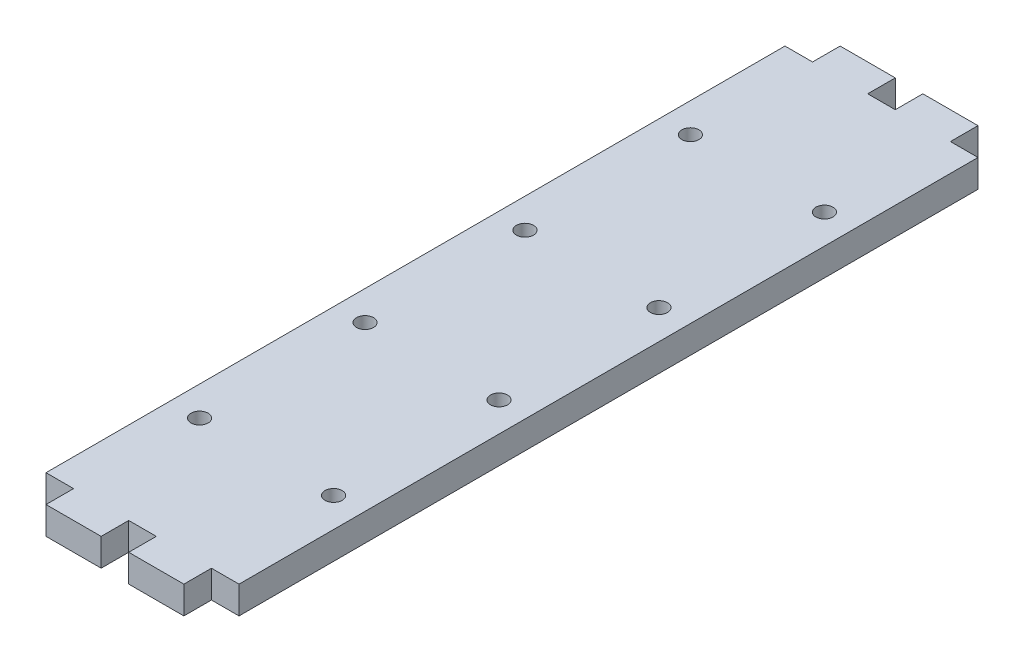
ISO-10303-21;
HEADER;
FILE_DESCRIPTION(('STEP AP214'),'2;1');
FILE_NAME('part.step','',(''),(''),'','','');
FILE_SCHEMA(('AUTOMOTIVE_DESIGN { 1 0 10303 214 1 1 1 1 }'));
ENDSEC;
DATA;
#1=APPLICATION_CONTEXT('core data for automotive mechanical design processes');
#2=APPLICATION_PROTOCOL_DEFINITION('international standard','automotive_design',2000,#1);
#3=PRODUCT_CONTEXT('',#1,'mechanical');
#4=PRODUCT('Part','Part','',(#3));
#5=PRODUCT_RELATED_PRODUCT_CATEGORY('part','',(#4));
#6=PRODUCT_DEFINITION_FORMATION('','',#4);
#7=PRODUCT_DEFINITION_CONTEXT('part definition',#1,'design');
#8=PRODUCT_DEFINITION('design','',#6,#7);
#9=PRODUCT_DEFINITION_SHAPE('','',#8);
#10=(LENGTH_UNIT() NAMED_UNIT(*) SI_UNIT(.MILLI.,.METRE.));
#11=(NAMED_UNIT(*) PLANE_ANGLE_UNIT() SI_UNIT($,.RADIAN.));
#12=(NAMED_UNIT(*) SI_UNIT($,.STERADIAN.) SOLID_ANGLE_UNIT());
#13=UNCERTAINTY_MEASURE_WITH_UNIT(LENGTH_MEASURE(1.E-05),#10,'distance_accuracy_value','');
#14=(GEOMETRIC_REPRESENTATION_CONTEXT(3) GLOBAL_UNCERTAINTY_ASSIGNED_CONTEXT((#13)) GLOBAL_UNIT_ASSIGNED_CONTEXT((#10,
#11,#12)) REPRESENTATION_CONTEXT('',''));
#15=CARTESIAN_POINT('',(0.,0.,0.));
#16=DIRECTION('',(0.,0.,1.));
#17=DIRECTION('',(1.,0.,0.));
#18=AXIS2_PLACEMENT_3D('',#15,#16,#17);
#19=CARTESIAN_POINT('',(0.,5.,0.));
#20=DIRECTION('',(0.,-1.,0.));
#21=DIRECTION('',(0.,0.,-1.));
#22=AXIS2_PLACEMENT_3D('',#19,#20,#21);
#23=PLANE('',#22);
#24=DIRECTION('',(0.,0.,1.));
#25=VECTOR('',#24,1.);
#26=CARTESIAN_POINT('',(-10.,5.,-65.2114285714286));
#27=LINE('',#26,#25);
#28=CARTESIAN_POINT('',(-10.,5.,-65.2114285714286));
#29=VERTEX_POINT('',#28);
#30=CARTESIAN_POINT('',(-10.,5.,-60.2114285714286));
#31=VERTEX_POINT('',#30);
#32=EDGE_CURVE('E242',#29,#31,#27,.T.);
#33=ORIENTED_EDGE('',*,*,#32,.T.);
#34=DIRECTION('',(-1.,0.,0.));
#35=VECTOR('',#34,1.);
#36=CARTESIAN_POINT('',(-10.,5.,-60.2114285714286));
#37=LINE('',#36,#35);
#38=CARTESIAN_POINT('',(-15.,5.,-60.2114285714286));
#39=VERTEX_POINT('',#38);
#40=EDGE_CURVE('E130',#31,#39,#37,.T.);
#41=ORIENTED_EDGE('',*,*,#40,.T.);
#42=DIRECTION('',(0.,0.,1.));
#43=VECTOR('',#42,1.);
#44=CARTESIAN_POINT('',(-15.,5.,-60.2114285714286));
#45=LINE('',#44,#43);
#46=CARTESIAN_POINT('',(-15.,5.,73.7885714285714));
#47=VERTEX_POINT('',#46);
#48=EDGE_CURVE('E293',#39,#47,#45,.T.);
#49=ORIENTED_EDGE('',*,*,#48,.T.);
#50=DIRECTION('',(1.,0.,0.));
#51=VECTOR('',#50,1.);
#52=CARTESIAN_POINT('',(-9.99999999999998,5.,73.7885714285714));
#53=LINE('',#52,#51);
#54=CARTESIAN_POINT('',(-9.99999999999998,5.,73.7885714285714));
#55=VERTEX_POINT('',#54);
#56=EDGE_CURVE('E312',#47,#55,#53,.T.);
#57=ORIENTED_EDGE('',*,*,#56,.T.);
#58=DIRECTION('',(0.,0.,1.));
#59=VECTOR('',#58,1.);
#60=CARTESIAN_POINT('',(-9.99999999999998,5.,78.7885714285714));
#61=LINE('',#60,#59);
#62=CARTESIAN_POINT('',(-9.99999999999998,5.,78.7885714285714));
#63=VERTEX_POINT('',#62);
#64=EDGE_CURVE('E309',#55,#63,#61,.T.);
#65=ORIENTED_EDGE('',*,*,#64,.T.);
#66=DIRECTION('',(1.,0.,0.));
#67=VECTOR('',#66,1.);
#68=CARTESIAN_POINT('',(-9.99999999999998,5.,78.7885714285714));
#69=LINE('',#68,#67);
#70=CARTESIAN_POINT('',(0.,5.,78.7885714285714));
#71=VERTEX_POINT('',#70);
#72=EDGE_CURVE('E311',#63,#71,#69,.T.);
#73=ORIENTED_EDGE('',*,*,#72,.T.);
#74=DIRECTION('',(0.,0.,-1.));
#75=VECTOR('',#74,1.);
#76=CARTESIAN_POINT('',(0.,5.,78.7885714285714));
#77=LINE('',#76,#75);
#78=CARTESIAN_POINT('',(0.,5.,73.7885714285714));
#79=VERTEX_POINT('',#78);
#80=EDGE_CURVE('E314',#71,#79,#77,.T.);
#81=ORIENTED_EDGE('',*,*,#80,.T.);
#82=DIRECTION('',(1.,0.,0.));
#83=VECTOR('',#82,1.);
#84=CARTESIAN_POINT('',(0.,5.,73.7885714285714));
#85=LINE('',#84,#83);
#86=CARTESIAN_POINT('',(5.,5.,73.7885714285714));
#87=VERTEX_POINT('',#86);
#88=EDGE_CURVE('E320',#79,#87,#85,.T.);
#89=ORIENTED_EDGE('',*,*,#88,.T.);
#90=DIRECTION('',(0.,0.,1.));
#91=VECTOR('',#90,1.);
#92=CARTESIAN_POINT('',(5.,5.,73.7885714285714));
#93=LINE('',#92,#91);
#94=CARTESIAN_POINT('',(5.,5.,78.7885714285714));
#95=VERTEX_POINT('',#94);
#96=EDGE_CURVE('E322',#87,#95,#93,.T.);
#97=ORIENTED_EDGE('',*,*,#96,.T.);
#98=DIRECTION('',(1.,0.,0.));
#99=VECTOR('',#98,1.);
#100=CARTESIAN_POINT('',(5.,5.,78.7885714285714));
#101=LINE('',#100,#99);
#102=CARTESIAN_POINT('',(15.,5.,78.7885714285714));
#103=VERTEX_POINT('',#102);
#104=EDGE_CURVE('E324',#95,#103,#101,.T.);
#105=ORIENTED_EDGE('',*,*,#104,.T.);
#106=DIRECTION('',(0.,0.,-1.));
#107=VECTOR('',#106,1.);
#108=CARTESIAN_POINT('',(15.,5.,78.7885714285714));
#109=LINE('',#108,#107);
#110=CARTESIAN_POINT('',(15.,5.,73.7885714285714));
#111=VERTEX_POINT('',#110);
#112=EDGE_CURVE('E326',#103,#111,#109,.T.);
#113=ORIENTED_EDGE('',*,*,#112,.T.);
#114=DIRECTION('',(1.,0.,0.));
#115=VECTOR('',#114,1.);
#116=CARTESIAN_POINT('',(15.,5.,73.7885714285714));
#117=LINE('',#116,#115);
#118=CARTESIAN_POINT('',(20.,5.,73.7885714285714));
#119=VERTEX_POINT('',#118);
#120=EDGE_CURVE('E328',#111,#119,#117,.T.);
#121=ORIENTED_EDGE('',*,*,#120,.T.);
#122=DIRECTION('',(0.,0.,-1.));
#123=VECTOR('',#122,1.);
#124=CARTESIAN_POINT('',(20.,5.,-60.2114285714286));
#125=LINE('',#124,#123);
#126=CARTESIAN_POINT('',(20.,5.,-60.2114285714286));
#127=VERTEX_POINT('',#126);
#128=EDGE_CURVE('E330',#119,#127,#125,.T.);
#129=ORIENTED_EDGE('',*,*,#128,.T.);
#130=DIRECTION('',(-1.,0.,0.));
#131=VECTOR('',#130,1.);
#132=CARTESIAN_POINT('',(15.,5.,-60.2114285714286));
#133=LINE('',#132,#131);
#134=CARTESIAN_POINT('',(15.,5.,-60.2114285714286));
#135=VERTEX_POINT('',#134);
#136=EDGE_CURVE('E332',#127,#135,#133,.T.);
#137=ORIENTED_EDGE('',*,*,#136,.T.);
#138=DIRECTION('',(0.,0.,-1.));
#139=VECTOR('',#138,1.);
#140=CARTESIAN_POINT('',(15.,5.,-65.2114285714286));
#141=LINE('',#140,#139);
#142=CARTESIAN_POINT('',(15.,5.,-65.2114285714286));
#143=VERTEX_POINT('',#142);
#144=EDGE_CURVE('E334',#135,#143,#141,.T.);
#145=ORIENTED_EDGE('',*,*,#144,.T.);
#146=DIRECTION('',(-1.,0.,0.));
#147=VECTOR('',#146,1.);
#148=CARTESIAN_POINT('',(15.,5.,-65.2114285714286));
#149=LINE('',#148,#147);
#150=CARTESIAN_POINT('',(5.,5.,-65.2114285714286));
#151=VERTEX_POINT('',#150);
#152=EDGE_CURVE('E336',#143,#151,#149,.T.);
#153=ORIENTED_EDGE('',*,*,#152,.T.);
#154=DIRECTION('',(0.,0.,1.));
#155=VECTOR('',#154,1.);
#156=CARTESIAN_POINT('',(5.,5.,-65.2114285714286));
#157=LINE('',#156,#155);
#158=CARTESIAN_POINT('',(5.,5.,-60.2114285714286));
#159=VERTEX_POINT('',#158);
#160=EDGE_CURVE('E185',#151,#159,#157,.T.);
#161=ORIENTED_EDGE('',*,*,#160,.T.);
#162=DIRECTION('',(-1.,0.,0.));
#163=VECTOR('',#162,1.);
#164=CARTESIAN_POINT('',(5.,5.,-60.2114285714286));
#165=LINE('',#164,#163);
#166=CARTESIAN_POINT('',(0.,5.,-60.2114285714286));
#167=VERTEX_POINT('',#166);
#168=EDGE_CURVE('E179',#159,#167,#165,.T.);
#169=ORIENTED_EDGE('',*,*,#168,.T.);
#170=DIRECTION('',(0.,0.,-1.));
#171=VECTOR('',#170,1.);
#172=CARTESIAN_POINT('',(0.,5.,-60.2114285714286));
#173=LINE('',#172,#171);
#174=CARTESIAN_POINT('',(0.,5.,-65.2114285714286));
#175=VERTEX_POINT('',#174);
#176=EDGE_CURVE('E183',#167,#175,#173,.T.);
#177=ORIENTED_EDGE('',*,*,#176,.T.);
#178=DIRECTION('',(-1.,0.,0.));
#179=VECTOR('',#178,1.);
#180=CARTESIAN_POINT('',(0.,5.,-65.2114285714286));
#181=LINE('',#180,#179);
#182=EDGE_CURVE('E51',#175,#29,#181,.T.);
#183=ORIENTED_EDGE('',*,*,#182,.T.);
#184=EDGE_LOOP('',(#33,#41,#49,#57,#65,#73,#81,#89,#97,#105,#113,#121,#129,#137,#145,#153,#161,
#169,#177,#183));
#185=FACE_BOUND('',#184,.T.);
#186=CARTESIAN_POINT('',(-9.64999999999999,5.,-37.7114285714286));
#187=DIRECTION('',(0.,1.,0.));
#188=DIRECTION('',(0.,0.,1.));
#189=AXIS2_PLACEMENT_3D('',#186,#187,#188);
#190=CIRCLE('',#189,1.55);
#191=CARTESIAN_POINT('',(-9.64999999999999,5.,-36.1614285714286));
#192=VERTEX_POINT('',#191);
#193=EDGE_CURVE('E207',#192,#192,#190,.T.);
#194=ORIENTED_EDGE('',*,*,#193,.F.);
#195=EDGE_LOOP('',(#194));
#196=FACE_BOUND('',#195,.T.);
#197=CARTESIAN_POINT('',(14.65,5.,-7.71142857142858));
#198=DIRECTION('',(0.,1.,0.));
#199=DIRECTION('',(0.,0.,1.));
#200=AXIS2_PLACEMENT_3D('',#197,#198,#199);
#201=CIRCLE('',#200,1.55);
#202=CARTESIAN_POINT('',(14.65,5.,-6.16142857142858));
#203=VERTEX_POINT('',#202);
#204=EDGE_CURVE('E440',#203,#203,#201,.T.);
#205=ORIENTED_EDGE('',*,*,#204,.F.);
#206=EDGE_LOOP('',(#205));
#207=FACE_BOUND('',#206,.T.);
#208=CARTESIAN_POINT('',(-9.64999999999998,5.,-7.71142857142858));
#209=DIRECTION('',(0.,1.,0.));
#210=DIRECTION('',(0.,0.,1.));
#211=AXIS2_PLACEMENT_3D('',#208,#209,#210);
#212=CIRCLE('',#211,1.55);
#213=CARTESIAN_POINT('',(-9.64999999999998,5.,-6.16142857142858));
#214=VERTEX_POINT('',#213);
#215=EDGE_CURVE('E434',#214,#214,#212,.T.);
#216=ORIENTED_EDGE('',*,*,#215,.F.);
#217=EDGE_LOOP('',(#216));
#218=FACE_BOUND('',#217,.T.);
#219=CARTESIAN_POINT('',(14.65,5.,-37.7114285714286));
#220=DIRECTION('',(0.,1.,0.));
#221=DIRECTION('',(0.,0.,1.));
#222=AXIS2_PLACEMENT_3D('',#219,#220,#221);
#223=CIRCLE('',#222,1.55);
#224=CARTESIAN_POINT('',(14.65,5.,-36.1614285714286));
#225=VERTEX_POINT('',#224);
#226=EDGE_CURVE('E428',#225,#225,#223,.T.);
#227=ORIENTED_EDGE('',*,*,#226,.F.);
#228=EDGE_LOOP('',(#227));
#229=FACE_BOUND('',#228,.T.);
#230=CARTESIAN_POINT('',(-9.64999999999997,5.,21.2885714285714));
#231=DIRECTION('',(0.,1.,0.));
#232=DIRECTION('',(0.,0.,-1.));
#233=AXIS2_PLACEMENT_3D('',#230,#231,#232);
#234=CIRCLE('',#233,1.55);
#235=CARTESIAN_POINT('',(-9.64999999999997,5.,19.7385714285714));
#236=VERTEX_POINT('',#235);
#237=EDGE_CURVE('E422',#236,#236,#234,.T.);
#238=ORIENTED_EDGE('',*,*,#237,.F.);
#239=EDGE_LOOP('',(#238));
#240=FACE_BOUND('',#239,.T.);
#241=CARTESIAN_POINT('',(-9.64999999999998,5.,51.2885714285714));
#242=DIRECTION('',(0.,1.,0.));
#243=DIRECTION('',(0.,0.,-1.));
#244=AXIS2_PLACEMENT_3D('',#241,#242,#243);
#245=CIRCLE('',#244,1.55);
#246=CARTESIAN_POINT('',(-9.64999999999998,5.,49.7385714285714));
#247=VERTEX_POINT('',#246);
#248=EDGE_CURVE('E416',#247,#247,#245,.T.);
#249=ORIENTED_EDGE('',*,*,#248,.F.);
#250=EDGE_LOOP('',(#249));
#251=FACE_BOUND('',#250,.T.);
#252=CARTESIAN_POINT('',(14.65,5.,21.2885714285714));
#253=DIRECTION('',(0.,1.,0.));
#254=DIRECTION('',(0.,0.,-1.));
#255=AXIS2_PLACEMENT_3D('',#252,#253,#254);
#256=CIRCLE('',#255,1.55);
#257=CARTESIAN_POINT('',(14.65,5.,19.7385714285714));
#258=VERTEX_POINT('',#257);
#259=EDGE_CURVE('E410',#258,#258,#256,.T.);
#260=ORIENTED_EDGE('',*,*,#259,.F.);
#261=EDGE_LOOP('',(#260));
#262=FACE_BOUND('',#261,.T.);
#263=CARTESIAN_POINT('',(14.65,5.,51.2885714285714));
#264=DIRECTION('',(0.,1.,0.));
#265=DIRECTION('',(0.,0.,-1.));
#266=AXIS2_PLACEMENT_3D('',#263,#264,#265);
#267=CIRCLE('',#266,1.55);
#268=CARTESIAN_POINT('',(14.65,5.,49.7385714285714));
#269=VERTEX_POINT('',#268);
#270=EDGE_CURVE('E401',#269,#269,#267,.T.);
#271=ORIENTED_EDGE('',*,*,#270,.F.);
#272=EDGE_LOOP('',(#271));
#273=FACE_BOUND('',#272,.T.);
#274=ADVANCED_FACE('F34',(#185,#196,#207,#218,#229,#240,#251,#262,#273),#23,.F.);
#275=CARTESIAN_POINT('',(0.,0.,0.));
#276=DIRECTION('',(0.,-1.,0.));
#277=DIRECTION('',(0.,0.,-1.));
#278=AXIS2_PLACEMENT_3D('',#275,#276,#277);
#279=PLANE('',#278);
#280=CARTESIAN_POINT('',(14.65,0.,21.2885714285714));
#281=DIRECTION('',(0.,1.,0.));
#282=DIRECTION('',(0.,0.,-1.));
#283=AXIS2_PLACEMENT_3D('',#280,#281,#282);
#284=CIRCLE('',#283,1.55);
#285=CARTESIAN_POINT('',(14.65,0.,19.7385714285714));
#286=VERTEX_POINT('',#285);
#287=EDGE_CURVE('E407',#286,#286,#284,.T.);
#288=ORIENTED_EDGE('',*,*,#287,.T.);
#289=EDGE_LOOP('',(#288));
#290=FACE_BOUND('',#289,.T.);
#291=CARTESIAN_POINT('',(-9.64999999999997,0.,21.2885714285714));
#292=DIRECTION('',(0.,1.,0.));
#293=DIRECTION('',(0.,0.,-1.));
#294=AXIS2_PLACEMENT_3D('',#291,#292,#293);
#295=CIRCLE('',#294,1.55);
#296=CARTESIAN_POINT('',(-9.64999999999997,0.,19.7385714285714));
#297=VERTEX_POINT('',#296);
#298=EDGE_CURVE('E419',#297,#297,#295,.T.);
#299=ORIENTED_EDGE('',*,*,#298,.T.);
#300=EDGE_LOOP('',(#299));
#301=FACE_BOUND('',#300,.T.);
#302=CARTESIAN_POINT('',(-9.64999999999998,0.,-7.71142857142858));
#303=DIRECTION('',(0.,1.,0.));
#304=DIRECTION('',(0.,0.,1.));
#305=AXIS2_PLACEMENT_3D('',#302,#303,#304);
#306=CIRCLE('',#305,1.55);
#307=CARTESIAN_POINT('',(-9.64999999999998,0.,-6.16142857142858));
#308=VERTEX_POINT('',#307);
#309=EDGE_CURVE('E431',#308,#308,#306,.T.);
#310=ORIENTED_EDGE('',*,*,#309,.T.);
#311=EDGE_LOOP('',(#310));
#312=FACE_BOUND('',#311,.T.);
#313=CARTESIAN_POINT('',(-9.64999999999999,0.,-37.7114285714286));
#314=DIRECTION('',(0.,1.,0.));
#315=DIRECTION('',(0.,0.,1.));
#316=AXIS2_PLACEMENT_3D('',#313,#314,#315);
#317=CIRCLE('',#316,1.55);
#318=CARTESIAN_POINT('',(-9.64999999999999,0.,-36.1614285714286));
#319=VERTEX_POINT('',#318);
#320=EDGE_CURVE('E443',#319,#319,#317,.T.);
#321=ORIENTED_EDGE('',*,*,#320,.T.);
#322=EDGE_LOOP('',(#321));
#323=FACE_BOUND('',#322,.T.);
#324=DIRECTION('',(0.,0.,1.));
#325=VECTOR('',#324,1.);
#326=CARTESIAN_POINT('',(-10.,0.,-65.2114285714286));
#327=LINE('',#326,#325);
#328=CARTESIAN_POINT('',(-10.,0.,-65.2114285714286));
#329=VERTEX_POINT('',#328);
#330=CARTESIAN_POINT('',(-10.,0.,-60.2114285714286));
#331=VERTEX_POINT('',#330);
#332=EDGE_CURVE('E203',#329,#331,#327,.T.);
#333=ORIENTED_EDGE('',*,*,#332,.F.);
#334=DIRECTION('',(-1.,0.,0.));
#335=VECTOR('',#334,1.);
#336=CARTESIAN_POINT('',(0.,0.,-65.2114285714286));
#337=LINE('',#336,#335);
#338=CARTESIAN_POINT('',(0.,0.,-65.2114285714286));
#339=VERTEX_POINT('',#338);
#340=EDGE_CURVE('E122',#339,#329,#337,.T.);
#341=ORIENTED_EDGE('',*,*,#340,.F.);
#342=DIRECTION('',(0.,0.,-1.));
#343=VECTOR('',#342,1.);
#344=CARTESIAN_POINT('',(0.,0.,-60.2114285714286));
#345=LINE('',#344,#343);
#346=CARTESIAN_POINT('',(0.,0.,-60.2114285714286));
#347=VERTEX_POINT('',#346);
#348=EDGE_CURVE('E116',#347,#339,#345,.T.);
#349=ORIENTED_EDGE('',*,*,#348,.F.);
#350=DIRECTION('',(-1.,0.,0.));
#351=VECTOR('',#350,1.);
#352=CARTESIAN_POINT('',(5.,0.,-60.2114285714286));
#353=LINE('',#352,#351);
#354=CARTESIAN_POINT('',(5.,0.,-60.2114285714286));
#355=VERTEX_POINT('',#354);
#356=EDGE_CURVE('E193',#355,#347,#353,.T.);
#357=ORIENTED_EDGE('',*,*,#356,.F.);
#358=DIRECTION('',(0.,0.,1.));
#359=VECTOR('',#358,1.);
#360=CARTESIAN_POINT('',(5.,0.,-65.2114285714286));
#361=LINE('',#360,#359);
#362=CARTESIAN_POINT('',(5.,0.,-65.2114285714286));
#363=VERTEX_POINT('',#362);
#364=EDGE_CURVE('E237',#363,#355,#361,.T.);
#365=ORIENTED_EDGE('',*,*,#364,.F.);
#366=DIRECTION('',(-1.,0.,0.));
#367=VECTOR('',#366,1.);
#368=CARTESIAN_POINT('',(15.,0.,-65.2114285714286));
#369=LINE('',#368,#367);
#370=CARTESIAN_POINT('',(15.,0.,-65.2114285714286));
#371=VERTEX_POINT('',#370);
#372=EDGE_CURVE('E235',#371,#363,#369,.T.);
#373=ORIENTED_EDGE('',*,*,#372,.F.);
#374=DIRECTION('',(0.,0.,-1.));
#375=VECTOR('',#374,1.);
#376=CARTESIAN_POINT('',(15.,0.,-65.2114285714286));
#377=LINE('',#376,#375);
#378=CARTESIAN_POINT('',(15.,0.,-60.2114285714286));
#379=VERTEX_POINT('',#378);
#380=EDGE_CURVE('E233',#379,#371,#377,.T.);
#381=ORIENTED_EDGE('',*,*,#380,.F.);
#382=DIRECTION('',(-1.,0.,0.));
#383=VECTOR('',#382,1.);
#384=CARTESIAN_POINT('',(15.,0.,-60.2114285714286));
#385=LINE('',#384,#383);
#386=CARTESIAN_POINT('',(20.,0.,-60.2114285714286));
#387=VERTEX_POINT('',#386);
#388=EDGE_CURVE('E231',#387,#379,#385,.T.);
#389=ORIENTED_EDGE('',*,*,#388,.F.);
#390=DIRECTION('',(0.,0.,-1.));
#391=VECTOR('',#390,1.);
#392=CARTESIAN_POINT('',(20.,0.,-60.2114285714286));
#393=LINE('',#392,#391);
#394=CARTESIAN_POINT('',(20.,0.,73.7885714285714));
#395=VERTEX_POINT('',#394);
#396=EDGE_CURVE('E229',#395,#387,#393,.T.);
#397=ORIENTED_EDGE('',*,*,#396,.F.);
#398=DIRECTION('',(1.,0.,0.));
#399=VECTOR('',#398,1.);
#400=CARTESIAN_POINT('',(15.,0.,73.7885714285714));
#401=LINE('',#400,#399);
#402=CARTESIAN_POINT('',(15.,0.,73.7885714285714));
#403=VERTEX_POINT('',#402);
#404=EDGE_CURVE('E227',#403,#395,#401,.T.);
#405=ORIENTED_EDGE('',*,*,#404,.F.);
#406=DIRECTION('',(0.,0.,-1.));
#407=VECTOR('',#406,1.);
#408=CARTESIAN_POINT('',(15.,0.,78.7885714285714));
#409=LINE('',#408,#407);
#410=CARTESIAN_POINT('',(15.,0.,78.7885714285714));
#411=VERTEX_POINT('',#410);
#412=EDGE_CURVE('E225',#411,#403,#409,.T.);
#413=ORIENTED_EDGE('',*,*,#412,.F.);
#414=DIRECTION('',(1.,0.,0.));
#415=VECTOR('',#414,1.);
#416=CARTESIAN_POINT('',(5.,0.,78.7885714285714));
#417=LINE('',#416,#415);
#418=CARTESIAN_POINT('',(5.,0.,78.7885714285714));
#419=VERTEX_POINT('',#418);
#420=EDGE_CURVE('E223',#419,#411,#417,.T.);
#421=ORIENTED_EDGE('',*,*,#420,.F.);
#422=DIRECTION('',(0.,0.,1.));
#423=VECTOR('',#422,1.);
#424=CARTESIAN_POINT('',(5.,0.,73.7885714285714));
#425=LINE('',#424,#423);
#426=CARTESIAN_POINT('',(5.,0.,73.7885714285714));
#427=VERTEX_POINT('',#426);
#428=EDGE_CURVE('E221',#427,#419,#425,.T.);
#429=ORIENTED_EDGE('',*,*,#428,.F.);
#430=DIRECTION('',(1.,0.,0.));
#431=VECTOR('',#430,1.);
#432=CARTESIAN_POINT('',(0.,0.,73.7885714285714));
#433=LINE('',#432,#431);
#434=CARTESIAN_POINT('',(0.,0.,73.7885714285714));
#435=VERTEX_POINT('',#434);
#436=EDGE_CURVE('E219',#435,#427,#433,.T.);
#437=ORIENTED_EDGE('',*,*,#436,.F.);
#438=DIRECTION('',(0.,0.,-1.));
#439=VECTOR('',#438,1.);
#440=CARTESIAN_POINT('',(0.,0.,78.7885714285714));
#441=LINE('',#440,#439);
#442=CARTESIAN_POINT('',(0.,0.,78.7885714285714));
#443=VERTEX_POINT('',#442);
#444=EDGE_CURVE('E217',#443,#435,#441,.T.);
#445=ORIENTED_EDGE('',*,*,#444,.F.);
#446=DIRECTION('',(1.,0.,0.));
#447=VECTOR('',#446,1.);
#448=CARTESIAN_POINT('',(-9.99999999999998,0.,78.7885714285714));
#449=LINE('',#448,#447);
#450=CARTESIAN_POINT('',(-9.99999999999998,0.,78.7885714285714));
#451=VERTEX_POINT('',#450);
#452=EDGE_CURVE('E215',#451,#443,#449,.T.);
#453=ORIENTED_EDGE('',*,*,#452,.F.);
#454=DIRECTION('',(0.,0.,1.));
#455=VECTOR('',#454,1.);
#456=CARTESIAN_POINT('',(-9.99999999999998,0.,78.7885714285714));
#457=LINE('',#456,#455);
#458=CARTESIAN_POINT('',(-9.99999999999998,0.,73.7885714285714));
#459=VERTEX_POINT('',#458);
#460=EDGE_CURVE('E213',#459,#451,#457,.T.);
#461=ORIENTED_EDGE('',*,*,#460,.F.);
#462=DIRECTION('',(1.,0.,0.));
#463=VECTOR('',#462,1.);
#464=CARTESIAN_POINT('',(-9.99999999999998,0.,73.7885714285714));
#465=LINE('',#464,#463);
#466=CARTESIAN_POINT('',(-15.,0.,73.7885714285714));
#467=VERTEX_POINT('',#466);
#468=EDGE_CURVE('E211',#467,#459,#465,.T.);
#469=ORIENTED_EDGE('',*,*,#468,.F.);
#470=DIRECTION('',(0.,0.,1.));
#471=VECTOR('',#470,1.);
#472=CARTESIAN_POINT('',(-15.,0.,-60.2114285714286));
#473=LINE('',#472,#471);
#474=CARTESIAN_POINT('',(-15.,0.,-60.2114285714286));
#475=VERTEX_POINT('',#474);
#476=EDGE_CURVE('E209',#475,#467,#473,.T.);
#477=ORIENTED_EDGE('',*,*,#476,.F.);
#478=DIRECTION('',(-1.,0.,0.));
#479=VECTOR('',#478,1.);
#480=CARTESIAN_POINT('',(-10.,0.,-60.2114285714286));
#481=LINE('',#480,#479);
#482=EDGE_CURVE('E206',#331,#475,#481,.T.);
#483=ORIENTED_EDGE('',*,*,#482,.F.);
#484=EDGE_LOOP('',(#333,#341,#349,#357,#365,#373,#381,#389,#397,#405,#413,#421,#429,#437,#445,
#453,#461,#469,#477,#483));
#485=FACE_BOUND('',#484,.T.);
#486=CARTESIAN_POINT('',(14.65,0.,-7.71142857142858));
#487=DIRECTION('',(0.,1.,0.));
#488=DIRECTION('',(0.,0.,1.));
#489=AXIS2_PLACEMENT_3D('',#486,#487,#488);
#490=CIRCLE('',#489,1.55);
#491=CARTESIAN_POINT('',(14.65,0.,-6.16142857142858));
#492=VERTEX_POINT('',#491);
#493=EDGE_CURVE('E437',#492,#492,#490,.T.);
#494=ORIENTED_EDGE('',*,*,#493,.T.);
#495=EDGE_LOOP('',(#494));
#496=FACE_BOUND('',#495,.T.);
#497=CARTESIAN_POINT('',(14.65,0.,-37.7114285714286));
#498=DIRECTION('',(0.,1.,0.));
#499=DIRECTION('',(0.,0.,1.));
#500=AXIS2_PLACEMENT_3D('',#497,#498,#499);
#501=CIRCLE('',#500,1.55);
#502=CARTESIAN_POINT('',(14.65,0.,-36.1614285714286));
#503=VERTEX_POINT('',#502);
#504=EDGE_CURVE('E425',#503,#503,#501,.T.);
#505=ORIENTED_EDGE('',*,*,#504,.T.);
#506=EDGE_LOOP('',(#505));
#507=FACE_BOUND('',#506,.T.);
#508=CARTESIAN_POINT('',(-9.64999999999998,0.,51.2885714285714));
#509=DIRECTION('',(0.,1.,0.));
#510=DIRECTION('',(0.,0.,-1.));
#511=AXIS2_PLACEMENT_3D('',#508,#509,#510);
#512=CIRCLE('',#511,1.55);
#513=CARTESIAN_POINT('',(-9.64999999999998,0.,49.7385714285714));
#514=VERTEX_POINT('',#513);
#515=EDGE_CURVE('E413',#514,#514,#512,.T.);
#516=ORIENTED_EDGE('',*,*,#515,.T.);
#517=EDGE_LOOP('',(#516));
#518=FACE_BOUND('',#517,.T.);
#519=CARTESIAN_POINT('',(14.65,0.,51.2885714285714));
#520=DIRECTION('',(0.,1.,0.));
#521=DIRECTION('',(0.,0.,-1.));
#522=AXIS2_PLACEMENT_3D('',#519,#520,#521);
#523=CIRCLE('',#522,1.55);
#524=CARTESIAN_POINT('',(14.65,0.,49.7385714285714));
#525=VERTEX_POINT('',#524);
#526=EDGE_CURVE('E404',#525,#525,#523,.T.);
#527=ORIENTED_EDGE('',*,*,#526,.T.);
#528=EDGE_LOOP('',(#527));
#529=FACE_BOUND('',#528,.T.);
#530=ADVANCED_FACE('F297',(#290,#301,#312,#323,#485,#496,#507,#518,#529),#279,.T.);
#531=CARTESIAN_POINT('',(-10.,5.,-65.2114285714286));
#532=DIRECTION('',(1.,0.,0.));
#533=DIRECTION('',(0.,0.,-1.));
#534=AXIS2_PLACEMENT_3D('',#531,#532,#533);
#535=PLANE('',#534);
#536=ORIENTED_EDGE('',*,*,#332,.T.);
#537=DIRECTION('',(0.,-1.,0.));
#538=VECTOR('',#537,1.);
#539=CARTESIAN_POINT('',(-10.,5.,-60.2114285714286));
#540=LINE('',#539,#538);
#541=EDGE_CURVE('E11',#31,#331,#540,.T.);
#542=ORIENTED_EDGE('',*,*,#541,.F.);
#543=ORIENTED_EDGE('',*,*,#32,.F.);
#544=DIRECTION('',(0.,-1.,0.));
#545=VECTOR('',#544,1.);
#546=CARTESIAN_POINT('',(-10.,5.,-65.2114285714286));
#547=LINE('',#546,#545);
#548=EDGE_CURVE('E199',#29,#329,#547,.T.);
#549=ORIENTED_EDGE('',*,*,#548,.T.);
#550=EDGE_LOOP('',(#536,#542,#543,#549));
#551=FACE_BOUND('',#550,.T.);
#552=ADVANCED_FACE('F36',(#551),#535,.F.);
#553=CARTESIAN_POINT('',(-10.,5.,-60.2114285714286));
#554=DIRECTION('',(0.,0.,1.));
#555=DIRECTION('',(1.,0.,0.));
#556=AXIS2_PLACEMENT_3D('',#553,#554,#555);
#557=PLANE('',#556);
#558=ORIENTED_EDGE('',*,*,#482,.T.);
#559=DIRECTION('',(0.,-1.,0.));
#560=VECTOR('',#559,1.);
#561=CARTESIAN_POINT('',(-15.,5.,-60.2114285714286));
#562=LINE('',#561,#560);
#563=EDGE_CURVE('E43',#39,#475,#562,.T.);
#564=ORIENTED_EDGE('',*,*,#563,.F.);
#565=ORIENTED_EDGE('',*,*,#40,.F.);
#566=ORIENTED_EDGE('',*,*,#541,.T.);
#567=EDGE_LOOP('',(#558,#564,#565,#566));
#568=FACE_BOUND('',#567,.T.);
#569=ADVANCED_FACE('F671',(#568),#557,.F.);
#570=CARTESIAN_POINT('',(-15.,5.,-60.2114285714286));
#571=DIRECTION('',(1.,0.,0.));
#572=DIRECTION('',(0.,0.,-1.));
#573=AXIS2_PLACEMENT_3D('',#570,#571,#572);
#574=PLANE('',#573);
#575=ORIENTED_EDGE('',*,*,#476,.T.);
#576=DIRECTION('',(0.,-1.,0.));
#577=VECTOR('',#576,1.);
#578=CARTESIAN_POINT('',(-15.,5.,73.7885714285714));
#579=LINE('',#578,#577);
#580=EDGE_CURVE('E285',#47,#467,#579,.T.);
#581=ORIENTED_EDGE('',*,*,#580,.F.);
#582=ORIENTED_EDGE('',*,*,#48,.F.);
#583=ORIENTED_EDGE('',*,*,#563,.T.);
#584=EDGE_LOOP('',(#575,#581,#582,#583));
#585=FACE_BOUND('',#584,.T.);
#586=ADVANCED_FACE('F291',(#585),#574,.F.);
#587=CARTESIAN_POINT('',(-9.99999999999998,5.,73.7885714285714));
#588=DIRECTION('',(0.,0.,-1.));
#589=DIRECTION('',(-1.,0.,0.));
#590=AXIS2_PLACEMENT_3D('',#587,#588,#589);
#591=PLANE('',#590);
#592=ORIENTED_EDGE('',*,*,#468,.T.);
#593=DIRECTION('',(0.,-1.,0.));
#594=VECTOR('',#593,1.);
#595=CARTESIAN_POINT('',(-9.99999999999998,5.,73.7885714285714));
#596=LINE('',#595,#594);
#597=EDGE_CURVE('E282',#55,#459,#596,.T.);
#598=ORIENTED_EDGE('',*,*,#597,.F.);
#599=ORIENTED_EDGE('',*,*,#56,.F.);
#600=ORIENTED_EDGE('',*,*,#580,.T.);
#601=EDGE_LOOP('',(#592,#598,#599,#600));
#602=FACE_BOUND('',#601,.T.);
#603=ADVANCED_FACE('F303',(#602),#591,.F.);
#604=CARTESIAN_POINT('',(-9.99999999999998,5.,78.7885714285714));
#605=DIRECTION('',(1.,0.,0.));
#606=DIRECTION('',(0.,0.,-1.));
#607=AXIS2_PLACEMENT_3D('',#604,#605,#606);
#608=PLANE('',#607);
#609=ORIENTED_EDGE('',*,*,#460,.T.);
#610=DIRECTION('',(0.,-1.,0.));
#611=VECTOR('',#610,1.);
#612=CARTESIAN_POINT('',(-9.99999999999998,5.,78.7885714285714));
#613=LINE('',#612,#611);
#614=EDGE_CURVE('E279',#63,#451,#613,.T.);
#615=ORIENTED_EDGE('',*,*,#614,.F.);
#616=ORIENTED_EDGE('',*,*,#64,.F.);
#617=ORIENTED_EDGE('',*,*,#597,.T.);
#618=EDGE_LOOP('',(#609,#615,#616,#617));
#619=FACE_BOUND('',#618,.T.);
#620=ADVANCED_FACE('F307',(#619),#608,.F.);
#621=CARTESIAN_POINT('',(-9.99999999999998,5.,78.7885714285714));
#622=DIRECTION('',(0.,0.,-1.));
#623=DIRECTION('',(-1.,0.,0.));
#624=AXIS2_PLACEMENT_3D('',#621,#622,#623);
#625=PLANE('',#624);
#626=ORIENTED_EDGE('',*,*,#452,.T.);
#627=DIRECTION('',(0.,-1.,0.));
#628=VECTOR('',#627,1.);
#629=CARTESIAN_POINT('',(0.,5.,78.7885714285714));
#630=LINE('',#629,#628);
#631=EDGE_CURVE('E276',#71,#443,#630,.T.);
#632=ORIENTED_EDGE('',*,*,#631,.F.);
#633=ORIENTED_EDGE('',*,*,#72,.F.);
#634=ORIENTED_EDGE('',*,*,#614,.T.);
#635=EDGE_LOOP('',(#626,#632,#633,#634));
#636=FACE_BOUND('',#635,.T.);
#637=ADVANCED_FACE('F636',(#636),#625,.F.);
#638=CARTESIAN_POINT('',(0.,5.,78.7885714285714));
#639=DIRECTION('',(-1.,0.,0.));
#640=DIRECTION('',(0.,0.,1.));
#641=AXIS2_PLACEMENT_3D('',#638,#639,#640);
#642=PLANE('',#641);
#643=ORIENTED_EDGE('',*,*,#444,.T.);
#644=DIRECTION('',(0.,-1.,0.));
#645=VECTOR('',#644,1.);
#646=CARTESIAN_POINT('',(0.,5.,73.7885714285714));
#647=LINE('',#646,#645);
#648=EDGE_CURVE('E273',#79,#435,#647,.T.);
#649=ORIENTED_EDGE('',*,*,#648,.F.);
#650=ORIENTED_EDGE('',*,*,#80,.F.);
#651=ORIENTED_EDGE('',*,*,#631,.T.);
#652=EDGE_LOOP('',(#643,#649,#650,#651));
#653=FACE_BOUND('',#652,.T.);
#654=ADVANCED_FACE('F626',(#653),#642,.F.);
#655=CARTESIAN_POINT('',(0.,5.,73.7885714285714));
#656=DIRECTION('',(0.,0.,-1.));
#657=DIRECTION('',(-1.,0.,0.));
#658=AXIS2_PLACEMENT_3D('',#655,#656,#657);
#659=PLANE('',#658);
#660=ORIENTED_EDGE('',*,*,#436,.T.);
#661=DIRECTION('',(0.,-1.,0.));
#662=VECTOR('',#661,1.);
#663=CARTESIAN_POINT('',(5.,5.,73.7885714285714));
#664=LINE('',#663,#662);
#665=EDGE_CURVE('E270',#87,#427,#664,.T.);
#666=ORIENTED_EDGE('',*,*,#665,.F.);
#667=ORIENTED_EDGE('',*,*,#88,.F.);
#668=ORIENTED_EDGE('',*,*,#648,.T.);
#669=EDGE_LOOP('',(#660,#666,#667,#668));
#670=FACE_BOUND('',#669,.T.);
#671=ADVANCED_FACE('F616',(#670),#659,.F.);
#672=CARTESIAN_POINT('',(5.,5.,73.7885714285714));
#673=DIRECTION('',(1.,0.,0.));
#674=DIRECTION('',(0.,0.,-1.));
#675=AXIS2_PLACEMENT_3D('',#672,#673,#674);
#676=PLANE('',#675);
#677=ORIENTED_EDGE('',*,*,#428,.T.);
#678=DIRECTION('',(0.,-1.,0.));
#679=VECTOR('',#678,1.);
#680=CARTESIAN_POINT('',(5.,5.,78.7885714285714));
#681=LINE('',#680,#679);
#682=EDGE_CURVE('E267',#95,#419,#681,.T.);
#683=ORIENTED_EDGE('',*,*,#682,.F.);
#684=ORIENTED_EDGE('',*,*,#96,.F.);
#685=ORIENTED_EDGE('',*,*,#665,.T.);
#686=EDGE_LOOP('',(#677,#683,#684,#685));
#687=FACE_BOUND('',#686,.T.);
#688=ADVANCED_FACE('F606',(#687),#676,.F.);
#689=CARTESIAN_POINT('',(5.,5.,78.7885714285714));
#690=DIRECTION('',(0.,0.,-1.));
#691=DIRECTION('',(-1.,0.,0.));
#692=AXIS2_PLACEMENT_3D('',#689,#690,#691);
#693=PLANE('',#692);
#694=ORIENTED_EDGE('',*,*,#420,.T.);
#695=DIRECTION('',(0.,-1.,0.));
#696=VECTOR('',#695,1.);
#697=CARTESIAN_POINT('',(15.,5.,78.7885714285714));
#698=LINE('',#697,#696);
#699=EDGE_CURVE('E264',#103,#411,#698,.T.);
#700=ORIENTED_EDGE('',*,*,#699,.F.);
#701=ORIENTED_EDGE('',*,*,#104,.F.);
#702=ORIENTED_EDGE('',*,*,#682,.T.);
#703=EDGE_LOOP('',(#694,#700,#701,#702));
#704=FACE_BOUND('',#703,.T.);
#705=ADVANCED_FACE('F596',(#704),#693,.F.);
#706=CARTESIAN_POINT('',(15.,5.,78.7885714285714));
#707=DIRECTION('',(-1.,0.,0.));
#708=DIRECTION('',(0.,0.,1.));
#709=AXIS2_PLACEMENT_3D('',#706,#707,#708);
#710=PLANE('',#709);
#711=ORIENTED_EDGE('',*,*,#412,.T.);
#712=DIRECTION('',(0.,-1.,0.));
#713=VECTOR('',#712,1.);
#714=CARTESIAN_POINT('',(15.,5.,73.7885714285714));
#715=LINE('',#714,#713);
#716=EDGE_CURVE('E261',#111,#403,#715,.T.);
#717=ORIENTED_EDGE('',*,*,#716,.F.);
#718=ORIENTED_EDGE('',*,*,#112,.F.);
#719=ORIENTED_EDGE('',*,*,#699,.T.);
#720=EDGE_LOOP('',(#711,#717,#718,#719));
#721=FACE_BOUND('',#720,.T.);
#722=ADVANCED_FACE('F586',(#721),#710,.F.);
#723=CARTESIAN_POINT('',(15.,5.,73.7885714285714));
#724=DIRECTION('',(0.,0.,-1.));
#725=DIRECTION('',(-1.,0.,0.));
#726=AXIS2_PLACEMENT_3D('',#723,#724,#725);
#727=PLANE('',#726);
#728=ORIENTED_EDGE('',*,*,#404,.T.);
#729=DIRECTION('',(0.,-1.,0.));
#730=VECTOR('',#729,1.);
#731=CARTESIAN_POINT('',(20.,5.,73.7885714285714));
#732=LINE('',#731,#730);
#733=EDGE_CURVE('E258',#119,#395,#732,.T.);
#734=ORIENTED_EDGE('',*,*,#733,.F.);
#735=ORIENTED_EDGE('',*,*,#120,.F.);
#736=ORIENTED_EDGE('',*,*,#716,.T.);
#737=EDGE_LOOP('',(#728,#734,#735,#736));
#738=FACE_BOUND('',#737,.T.);
#739=ADVANCED_FACE('F576',(#738),#727,.F.);
#740=CARTESIAN_POINT('',(20.,5.,-60.2114285714286));
#741=DIRECTION('',(-1.,0.,0.));
#742=DIRECTION('',(0.,0.,1.));
#743=AXIS2_PLACEMENT_3D('',#740,#741,#742);
#744=PLANE('',#743);
#745=ORIENTED_EDGE('',*,*,#396,.T.);
#746=DIRECTION('',(0.,-1.,0.));
#747=VECTOR('',#746,1.);
#748=CARTESIAN_POINT('',(20.,5.,-60.2114285714286));
#749=LINE('',#748,#747);
#750=EDGE_CURVE('E255',#127,#387,#749,.T.);
#751=ORIENTED_EDGE('',*,*,#750,.F.);
#752=ORIENTED_EDGE('',*,*,#128,.F.);
#753=ORIENTED_EDGE('',*,*,#733,.T.);
#754=EDGE_LOOP('',(#745,#751,#752,#753));
#755=FACE_BOUND('',#754,.T.);
#756=ADVANCED_FACE('F566',(#755),#744,.F.);
#757=CARTESIAN_POINT('',(15.,5.,-60.2114285714286));
#758=DIRECTION('',(0.,0.,1.));
#759=DIRECTION('',(1.,0.,0.));
#760=AXIS2_PLACEMENT_3D('',#757,#758,#759);
#761=PLANE('',#760);
#762=ORIENTED_EDGE('',*,*,#388,.T.);
#763=DIRECTION('',(0.,-1.,0.));
#764=VECTOR('',#763,1.);
#765=CARTESIAN_POINT('',(15.,5.,-60.2114285714286));
#766=LINE('',#765,#764);
#767=EDGE_CURVE('E252',#135,#379,#766,.T.);
#768=ORIENTED_EDGE('',*,*,#767,.F.);
#769=ORIENTED_EDGE('',*,*,#136,.F.);
#770=ORIENTED_EDGE('',*,*,#750,.T.);
#771=EDGE_LOOP('',(#762,#768,#769,#770));
#772=FACE_BOUND('',#771,.T.);
#773=ADVANCED_FACE('F556',(#772),#761,.F.);
#774=CARTESIAN_POINT('',(15.,5.,-65.2114285714286));
#775=DIRECTION('',(-1.,0.,0.));
#776=DIRECTION('',(0.,0.,1.));
#777=AXIS2_PLACEMENT_3D('',#774,#775,#776);
#778=PLANE('',#777);
#779=ORIENTED_EDGE('',*,*,#380,.T.);
#780=DIRECTION('',(0.,-1.,0.));
#781=VECTOR('',#780,1.);
#782=CARTESIAN_POINT('',(15.,5.,-65.2114285714286));
#783=LINE('',#782,#781);
#784=EDGE_CURVE('E249',#143,#371,#783,.T.);
#785=ORIENTED_EDGE('',*,*,#784,.F.);
#786=ORIENTED_EDGE('',*,*,#144,.F.);
#787=ORIENTED_EDGE('',*,*,#767,.T.);
#788=EDGE_LOOP('',(#779,#785,#786,#787));
#789=FACE_BOUND('',#788,.T.);
#790=ADVANCED_FACE('F547',(#789),#778,.F.);
#791=CARTESIAN_POINT('',(15.,5.,-65.2114285714286));
#792=DIRECTION('',(0.,0.,1.));
#793=DIRECTION('',(1.,0.,0.));
#794=AXIS2_PLACEMENT_3D('',#791,#792,#793);
#795=PLANE('',#794);
#796=ORIENTED_EDGE('',*,*,#372,.T.);
#797=DIRECTION('',(0.,-1.,0.));
#798=VECTOR('',#797,1.);
#799=CARTESIAN_POINT('',(5.,5.,-65.2114285714286));
#800=LINE('',#799,#798);
#801=EDGE_CURVE('E246',#151,#363,#800,.T.);
#802=ORIENTED_EDGE('',*,*,#801,.F.);
#803=ORIENTED_EDGE('',*,*,#152,.F.);
#804=ORIENTED_EDGE('',*,*,#784,.T.);
#805=EDGE_LOOP('',(#796,#802,#803,#804));
#806=FACE_BOUND('',#805,.T.);
#807=ADVANCED_FACE('F342',(#806),#795,.F.);
#808=CARTESIAN_POINT('',(5.,5.,-65.2114285714286));
#809=DIRECTION('',(1.,0.,0.));
#810=DIRECTION('',(0.,0.,-1.));
#811=AXIS2_PLACEMENT_3D('',#808,#809,#810);
#812=PLANE('',#811);
#813=ORIENTED_EDGE('',*,*,#364,.T.);
#814=DIRECTION('',(0.,-1.,0.));
#815=VECTOR('',#814,1.);
#816=CARTESIAN_POINT('',(5.,5.,-60.2114285714286));
#817=LINE('',#816,#815);
#818=EDGE_CURVE('E194',#159,#355,#817,.T.);
#819=ORIENTED_EDGE('',*,*,#818,.F.);
#820=ORIENTED_EDGE('',*,*,#160,.F.);
#821=ORIENTED_EDGE('',*,*,#801,.T.);
#822=EDGE_LOOP('',(#813,#819,#820,#821));
#823=FACE_BOUND('',#822,.T.);
#824=ADVANCED_FACE('F346',(#823),#812,.F.);
#825=CARTESIAN_POINT('',(5.,5.,-60.2114285714286));
#826=DIRECTION('',(0.,0.,1.));
#827=DIRECTION('',(1.,0.,0.));
#828=AXIS2_PLACEMENT_3D('',#825,#826,#827);
#829=PLANE('',#828);
#830=ORIENTED_EDGE('',*,*,#356,.T.);
#831=DIRECTION('',(0.,-1.,0.));
#832=VECTOR('',#831,1.);
#833=CARTESIAN_POINT('',(0.,5.,-60.2114285714286));
#834=LINE('',#833,#832);
#835=EDGE_CURVE('E190',#167,#347,#834,.T.);
#836=ORIENTED_EDGE('',*,*,#835,.F.);
#837=ORIENTED_EDGE('',*,*,#168,.F.);
#838=ORIENTED_EDGE('',*,*,#818,.T.);
#839=EDGE_LOOP('',(#830,#836,#837,#838));
#840=FACE_BOUND('',#839,.T.);
#841=ADVANCED_FACE('F191',(#840),#829,.F.);
#842=CARTESIAN_POINT('',(0.,5.,-60.2114285714286));
#843=DIRECTION('',(-1.,0.,0.));
#844=DIRECTION('',(0.,0.,1.));
#845=AXIS2_PLACEMENT_3D('',#842,#843,#844);
#846=PLANE('',#845);
#847=ORIENTED_EDGE('',*,*,#348,.T.);
#848=DIRECTION('',(0.,-1.,0.));
#849=VECTOR('',#848,1.);
#850=CARTESIAN_POINT('',(0.,5.,-65.2114285714286));
#851=LINE('',#850,#849);
#852=EDGE_CURVE('E195',#175,#339,#851,.T.);
#853=ORIENTED_EDGE('',*,*,#852,.F.);
#854=ORIENTED_EDGE('',*,*,#176,.F.);
#855=ORIENTED_EDGE('',*,*,#835,.T.);
#856=EDGE_LOOP('',(#847,#853,#854,#855));
#857=FACE_BOUND('',#856,.T.);
#858=ADVANCED_FACE('F197',(#857),#846,.F.);
#859=CARTESIAN_POINT('',(0.,5.,-65.2114285714286));
#860=DIRECTION('',(0.,0.,1.));
#861=DIRECTION('',(1.,0.,0.));
#862=AXIS2_PLACEMENT_3D('',#859,#860,#861);
#863=PLANE('',#862);
#864=ORIENTED_EDGE('',*,*,#340,.T.);
#865=ORIENTED_EDGE('',*,*,#548,.F.);
#866=ORIENTED_EDGE('',*,*,#182,.F.);
#867=ORIENTED_EDGE('',*,*,#852,.T.);
#868=EDGE_LOOP('',(#864,#865,#866,#867));
#869=FACE_BOUND('',#868,.T.);
#870=ADVANCED_FACE('F350',(#869),#863,.F.);
#871=CARTESIAN_POINT('',(-9.64999999999999,5.,-37.7114285714286));
#872=DIRECTION('',(0.,-1.,0.));
#873=DIRECTION('',(0.,0.,-1.));
#874=AXIS2_PLACEMENT_3D('',#871,#872,#873);
#875=CYLINDRICAL_SURFACE('',#874,1.55);
#876=ORIENTED_EDGE('',*,*,#193,.T.);
#877=EDGE_LOOP('',(#876));
#878=FACE_BOUND('',#877,.T.);
#879=ORIENTED_EDGE('',*,*,#320,.F.);
#880=EDGE_LOOP('',(#879));
#881=FACE_BOUND('',#880,.T.);
#882=ADVANCED_FACE('F352',(#878,#881),#875,.F.);
#883=CARTESIAN_POINT('',(14.65,5.,-7.71142857142858));
#884=DIRECTION('',(0.,-1.,0.));
#885=DIRECTION('',(0.,0.,-1.));
#886=AXIS2_PLACEMENT_3D('',#883,#884,#885);
#887=CYLINDRICAL_SURFACE('',#886,1.55);
#888=ORIENTED_EDGE('',*,*,#204,.T.);
#889=EDGE_LOOP('',(#888));
#890=FACE_BOUND('',#889,.T.);
#891=ORIENTED_EDGE('',*,*,#493,.F.);
#892=EDGE_LOOP('',(#891));
#893=FACE_BOUND('',#892,.T.);
#894=ADVANCED_FACE('F358',(#890,#893),#887,.F.);
#895=CARTESIAN_POINT('',(-9.64999999999998,5.,-7.71142857142858));
#896=DIRECTION('',(0.,-1.,0.));
#897=DIRECTION('',(0.,0.,-1.));
#898=AXIS2_PLACEMENT_3D('',#895,#896,#897);
#899=CYLINDRICAL_SURFACE('',#898,1.55);
#900=ORIENTED_EDGE('',*,*,#215,.T.);
#901=EDGE_LOOP('',(#900));
#902=FACE_BOUND('',#901,.T.);
#903=ORIENTED_EDGE('',*,*,#309,.F.);
#904=EDGE_LOOP('',(#903));
#905=FACE_BOUND('',#904,.T.);
#906=ADVANCED_FACE('F372',(#902,#905),#899,.F.);
#907=CARTESIAN_POINT('',(14.65,5.,-37.7114285714286));
#908=DIRECTION('',(0.,-1.,0.));
#909=DIRECTION('',(0.,0.,-1.));
#910=AXIS2_PLACEMENT_3D('',#907,#908,#909);
#911=CYLINDRICAL_SURFACE('',#910,1.55);
#912=ORIENTED_EDGE('',*,*,#226,.T.);
#913=EDGE_LOOP('',(#912));
#914=FACE_BOUND('',#913,.T.);
#915=ORIENTED_EDGE('',*,*,#504,.F.);
#916=EDGE_LOOP('',(#915));
#917=FACE_BOUND('',#916,.T.);
#918=ADVANCED_FACE('F376',(#914,#917),#911,.F.);
#919=CARTESIAN_POINT('',(-9.64999999999997,5.,21.2885714285714));
#920=DIRECTION('',(0.,-1.,0.));
#921=DIRECTION('',(0.,0.,-1.));
#922=AXIS2_PLACEMENT_3D('',#919,#920,#921);
#923=CYLINDRICAL_SURFACE('',#922,1.55);
#924=ORIENTED_EDGE('',*,*,#237,.T.);
#925=EDGE_LOOP('',(#924));
#926=FACE_BOUND('',#925,.T.);
#927=ORIENTED_EDGE('',*,*,#298,.F.);
#928=EDGE_LOOP('',(#927));
#929=FACE_BOUND('',#928,.T.);
#930=ADVANCED_FACE('F380',(#926,#929),#923,.F.);
#931=CARTESIAN_POINT('',(-9.64999999999998,5.,51.2885714285714));
#932=DIRECTION('',(0.,-1.,0.));
#933=DIRECTION('',(0.,0.,-1.));
#934=AXIS2_PLACEMENT_3D('',#931,#932,#933);
#935=CYLINDRICAL_SURFACE('',#934,1.55);
#936=ORIENTED_EDGE('',*,*,#248,.T.);
#937=EDGE_LOOP('',(#936));
#938=FACE_BOUND('',#937,.T.);
#939=ORIENTED_EDGE('',*,*,#515,.F.);
#940=EDGE_LOOP('',(#939));
#941=FACE_BOUND('',#940,.T.);
#942=ADVANCED_FACE('F384',(#938,#941),#935,.F.);
#943=CARTESIAN_POINT('',(14.65,5.,21.2885714285714));
#944=DIRECTION('',(0.,-1.,0.));
#945=DIRECTION('',(0.,0.,-1.));
#946=AXIS2_PLACEMENT_3D('',#943,#944,#945);
#947=CYLINDRICAL_SURFACE('',#946,1.55);
#948=ORIENTED_EDGE('',*,*,#259,.T.);
#949=EDGE_LOOP('',(#948));
#950=FACE_BOUND('',#949,.T.);
#951=ORIENTED_EDGE('',*,*,#287,.F.);
#952=EDGE_LOOP('',(#951));
#953=FACE_BOUND('',#952,.T.);
#954=ADVANCED_FACE('F388',(#950,#953),#947,.F.);
#955=CARTESIAN_POINT('',(14.65,5.,51.2885714285714));
#956=DIRECTION('',(0.,-1.,0.));
#957=DIRECTION('',(0.,0.,-1.));
#958=AXIS2_PLACEMENT_3D('',#955,#956,#957);
#959=CYLINDRICAL_SURFACE('',#958,1.55);
#960=ORIENTED_EDGE('',*,*,#270,.T.);
#961=EDGE_LOOP('',(#960));
#962=FACE_BOUND('',#961,.T.);
#963=ORIENTED_EDGE('',*,*,#526,.F.);
#964=EDGE_LOOP('',(#963));
#965=FACE_BOUND('',#964,.T.);
#966=ADVANCED_FACE('F392',(#962,#965),#959,.F.);
#967=CLOSED_SHELL('',(#274,#530,#552,#569,#586,#603,#620,#637,#654,#671,#688,#705,#722,#739,
#756,#773,#790,#807,#824,#841,#858,#870,#882,#894,#906,#918,#930,#942,#954,#966));
#968=MANIFOLD_SOLID_BREP('B2',#967);
#969=ADVANCED_BREP_SHAPE_REPRESENTATION('',(#18,#968),#14);
#970=SHAPE_DEFINITION_REPRESENTATION(#9,#969);
ENDSEC;
END-ISO-10303-21;
